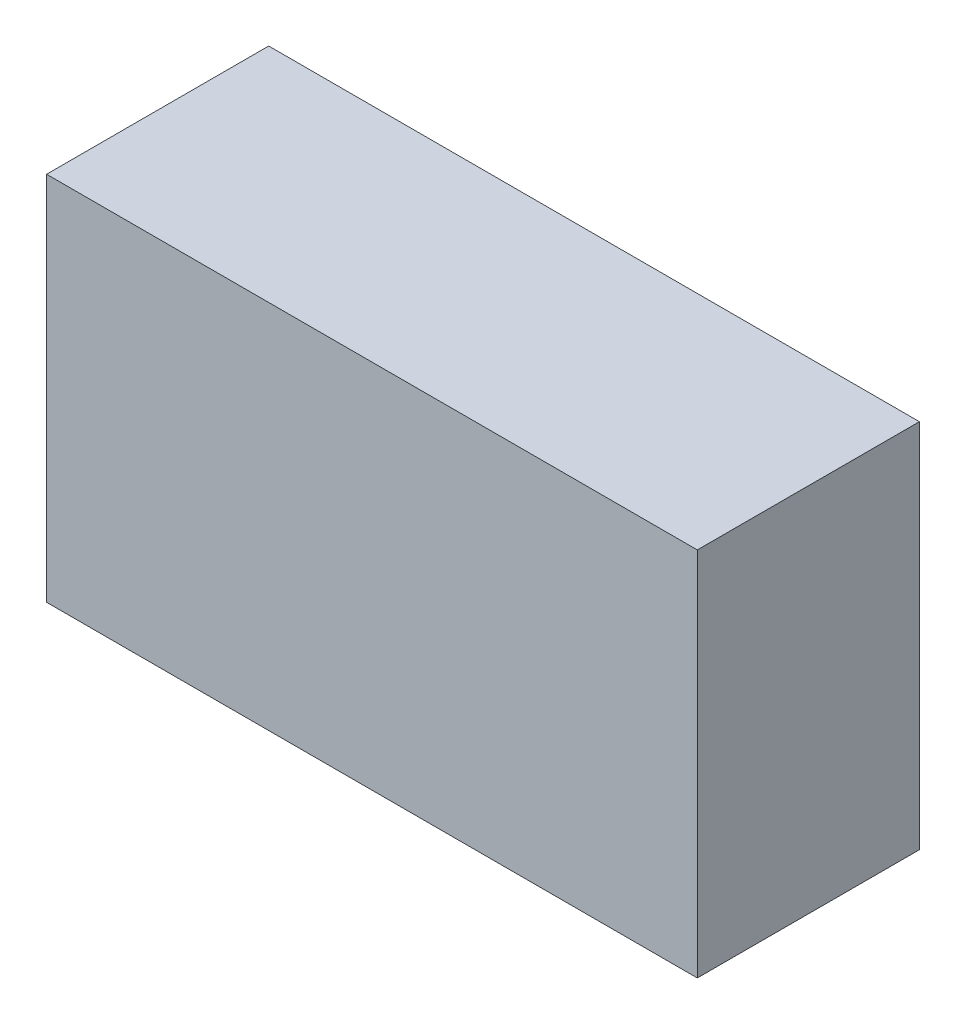
ISO-10303-21;
HEADER;
FILE_DESCRIPTION(('STEP AP214'),'2;1');
FILE_NAME('part.step','',(''),(''),'','','');
FILE_SCHEMA(('AUTOMOTIVE_DESIGN { 1 0 10303 214 1 1 1 1 }'));
ENDSEC;
DATA;
#1=APPLICATION_CONTEXT('core data for automotive mechanical design processes');
#2=APPLICATION_PROTOCOL_DEFINITION('international standard','automotive_design',2000,#1);
#3=PRODUCT_CONTEXT('',#1,'mechanical');
#4=PRODUCT('Part','Part','',(#3));
#5=PRODUCT_RELATED_PRODUCT_CATEGORY('part','',(#4));
#6=PRODUCT_DEFINITION_FORMATION('','',#4);
#7=PRODUCT_DEFINITION_CONTEXT('part definition',#1,'design');
#8=PRODUCT_DEFINITION('design','',#6,#7);
#9=PRODUCT_DEFINITION_SHAPE('','',#8);
#10=(LENGTH_UNIT() NAMED_UNIT(*) SI_UNIT(.MILLI.,.METRE.));
#11=(NAMED_UNIT(*) PLANE_ANGLE_UNIT() SI_UNIT($,.RADIAN.));
#12=(NAMED_UNIT(*) SI_UNIT($,.STERADIAN.) SOLID_ANGLE_UNIT());
#13=UNCERTAINTY_MEASURE_WITH_UNIT(LENGTH_MEASURE(1.E-05),#10,'distance_accuracy_value','');
#14=(GEOMETRIC_REPRESENTATION_CONTEXT(3) GLOBAL_UNCERTAINTY_ASSIGNED_CONTEXT((#13)) GLOBAL_UNIT_ASSIGNED_CONTEXT((#10,
#11,#12)) REPRESENTATION_CONTEXT('',''));
#15=CARTESIAN_POINT('',(0.,0.,0.));
#16=DIRECTION('',(0.,0.,1.));
#17=DIRECTION('',(1.,0.,0.));
#18=AXIS2_PLACEMENT_3D('',#15,#16,#17);
#19=CARTESIAN_POINT('',(-41.4155,77.5714301256037,7.25));
#20=DIRECTION('',(1.,0.,0.));
#21=DIRECTION('',(0.,0.,-1.));
#22=AXIS2_PLACEMENT_3D('',#19,#20,#21);
#23=PLANE('',#22);
#24=DIRECTION('',(0.,-1.,0.));
#25=VECTOR('',#24,1.);
#26=CARTESIAN_POINT('',(-41.4155,77.5714301256037,0.));
#27=LINE('',#26,#25);
#28=CARTESIAN_POINT('',(-41.4155,77.5714301256037,0.));
#29=VERTEX_POINT('',#28);
#30=CARTESIAN_POINT('',(-41.4155,65.47,0.));
#31=VERTEX_POINT('',#30);
#32=EDGE_CURVE('E128',#29,#31,#27,.T.);
#33=ORIENTED_EDGE('',*,*,#32,.T.);
#34=DIRECTION('',(0.,0.,-1.));
#35=VECTOR('',#34,1.);
#36=CARTESIAN_POINT('',(-41.4155,65.47,7.25));
#37=LINE('',#36,#35);
#38=CARTESIAN_POINT('',(-41.4155,65.47,7.25));
#39=VERTEX_POINT('',#38);
#40=EDGE_CURVE('E11',#39,#31,#37,.T.);
#41=ORIENTED_EDGE('',*,*,#40,.F.);
#42=DIRECTION('',(0.,-1.,0.));
#43=VECTOR('',#42,1.);
#44=CARTESIAN_POINT('',(-41.4155,77.5714301256037,7.25));
#45=LINE('',#44,#43);
#46=CARTESIAN_POINT('',(-41.4155,77.5714301256037,7.25));
#47=VERTEX_POINT('',#46);
#48=EDGE_CURVE('E148',#47,#39,#45,.T.);
#49=ORIENTED_EDGE('',*,*,#48,.F.);
#50=DIRECTION('',(0.,0.,-1.));
#51=VECTOR('',#50,1.);
#52=CARTESIAN_POINT('',(-41.4155,77.5714301256037,7.25));
#53=LINE('',#52,#51);
#54=EDGE_CURVE('E153',#47,#29,#53,.T.);
#55=ORIENTED_EDGE('',*,*,#54,.T.);
#56=EDGE_LOOP('',(#33,#41,#49,#55));
#57=FACE_BOUND('',#56,.T.);
#58=ADVANCED_FACE('F32',(#57),#23,.F.);
#59=CARTESIAN_POINT('',(-41.4155,65.47,7.25));
#60=DIRECTION('',(0.,1.,0.));
#61=DIRECTION('',(0.,0.,1.));
#62=AXIS2_PLACEMENT_3D('',#59,#60,#61);
#63=PLANE('',#62);
#64=DIRECTION('',(1.,0.,0.));
#65=VECTOR('',#64,1.);
#66=CARTESIAN_POINT('',(-41.4155,65.47,0.));
#67=LINE('',#66,#65);
#68=CARTESIAN_POINT('',(-20.1755,65.47,0.));
#69=VERTEX_POINT('',#68);
#70=EDGE_CURVE('E132',#31,#69,#67,.T.);
#71=ORIENTED_EDGE('',*,*,#70,.T.);
#72=DIRECTION('',(0.,0.,-1.));
#73=VECTOR('',#72,1.);
#74=CARTESIAN_POINT('',(-20.1755,65.47,7.25));
#75=LINE('',#74,#73);
#76=CARTESIAN_POINT('',(-20.1755,65.47,7.25));
#77=VERTEX_POINT('',#76);
#78=EDGE_CURVE('E39',#77,#69,#75,.T.);
#79=ORIENTED_EDGE('',*,*,#78,.F.);
#80=DIRECTION('',(1.,0.,0.));
#81=VECTOR('',#80,1.);
#82=CARTESIAN_POINT('',(-41.4155,65.47,7.25));
#83=LINE('',#82,#81);
#84=EDGE_CURVE('E83',#39,#77,#83,.T.);
#85=ORIENTED_EDGE('',*,*,#84,.F.);
#86=ORIENTED_EDGE('',*,*,#40,.T.);
#87=EDGE_LOOP('',(#71,#79,#85,#86));
#88=FACE_BOUND('',#87,.T.);
#89=ADVANCED_FACE('F182',(#88),#63,.F.);
#90=CARTESIAN_POINT('',(-20.1755,77.5714301256037,7.25));
#91=DIRECTION('',(-1.,0.,0.));
#92=DIRECTION('',(0.,0.,1.));
#93=AXIS2_PLACEMENT_3D('',#90,#91,#92);
#94=PLANE('',#93);
#95=DIRECTION('',(0.,1.,0.));
#96=VECTOR('',#95,1.);
#97=CARTESIAN_POINT('',(-20.1755,77.5714301256037,0.));
#98=LINE('',#97,#96);
#99=CARTESIAN_POINT('',(-20.1755,77.5714301256037,0.));
#100=VERTEX_POINT('',#99);
#101=EDGE_CURVE('E156',#69,#100,#98,.T.);
#102=ORIENTED_EDGE('',*,*,#101,.T.);
#103=DIRECTION('',(0.,0.,-1.));
#104=VECTOR('',#103,1.);
#105=CARTESIAN_POINT('',(-20.1755,77.5714301256037,7.25));
#106=LINE('',#105,#104);
#107=CARTESIAN_POINT('',(-20.1755,77.5714301256037,7.25));
#108=VERTEX_POINT('',#107);
#109=EDGE_CURVE('E160',#108,#100,#106,.T.);
#110=ORIENTED_EDGE('',*,*,#109,.F.);
#111=DIRECTION('',(0.,1.,0.));
#112=VECTOR('',#111,1.);
#113=CARTESIAN_POINT('',(-20.1755,77.5714301256037,7.25));
#114=LINE('',#113,#112);
#115=EDGE_CURVE('E151',#77,#108,#114,.T.);
#116=ORIENTED_EDGE('',*,*,#115,.F.);
#117=ORIENTED_EDGE('',*,*,#78,.T.);
#118=EDGE_LOOP('',(#102,#110,#116,#117));
#119=FACE_BOUND('',#118,.T.);
#120=ADVANCED_FACE('F165',(#119),#94,.F.);
#121=CARTESIAN_POINT('',(-41.4155,77.5714301256037,7.25));
#122=DIRECTION('',(0.,-1.,0.));
#123=DIRECTION('',(0.,0.,-1.));
#124=AXIS2_PLACEMENT_3D('',#121,#122,#123);
#125=PLANE('',#124);
#126=DIRECTION('',(-1.,0.,0.));
#127=VECTOR('',#126,1.);
#128=CARTESIAN_POINT('',(-41.4155,77.5714301256037,0.));
#129=LINE('',#128,#127);
#130=EDGE_CURVE('E76',#100,#29,#129,.T.);
#131=ORIENTED_EDGE('',*,*,#130,.T.);
#132=ORIENTED_EDGE('',*,*,#54,.F.);
#133=DIRECTION('',(-1.,0.,0.));
#134=VECTOR('',#133,1.);
#135=CARTESIAN_POINT('',(-41.4155,77.5714301256037,7.25));
#136=LINE('',#135,#134);
#137=EDGE_CURVE('E55',#108,#47,#136,.T.);
#138=ORIENTED_EDGE('',*,*,#137,.F.);
#139=ORIENTED_EDGE('',*,*,#109,.T.);
#140=EDGE_LOOP('',(#131,#132,#138,#139));
#141=FACE_BOUND('',#140,.T.);
#142=ADVANCED_FACE('F173',(#141),#125,.F.);
#143=CARTESIAN_POINT('',(0.,0.,7.25));
#144=DIRECTION('',(0.,0.,1.));
#145=DIRECTION('',(1.,0.,0.));
#146=AXIS2_PLACEMENT_3D('',#143,#144,#145);
#147=PLANE('',#146);
#148=ORIENTED_EDGE('',*,*,#48,.T.);
#149=ORIENTED_EDGE('',*,*,#84,.T.);
#150=ORIENTED_EDGE('',*,*,#115,.T.);
#151=ORIENTED_EDGE('',*,*,#137,.T.);
#152=EDGE_LOOP('',(#148,#149,#150,#151));
#153=FACE_BOUND('',#152,.T.);
#154=ADVANCED_FACE('F175',(#153),#147,.T.);
#155=CARTESIAN_POINT('',(0.,0.,0.));
#156=DIRECTION('',(0.,0.,1.));
#157=DIRECTION('',(1.,0.,0.));
#158=AXIS2_PLACEMENT_3D('',#155,#156,#157);
#159=PLANE('',#158);
#160=DIRECTION('',(-1.,0.,0.));
#161=VECTOR('',#160,1.);
#162=CARTESIAN_POINT('',(-41.4155,77.0714301256037,0.));
#163=LINE('',#162,#161);
#164=CARTESIAN_POINT('',(-20.6755,77.0714301256037,0.));
#165=VERTEX_POINT('',#164);
#166=CARTESIAN_POINT('',(-40.9155,77.0714301256037,0.));
#167=VERTEX_POINT('',#166);
#168=EDGE_CURVE('E123',#165,#167,#163,.T.);
#169=ORIENTED_EDGE('',*,*,#168,.T.);
#170=DIRECTION('',(0.,-1.,0.));
#171=VECTOR('',#170,1.);
#172=CARTESIAN_POINT('',(-40.9155,77.5714301256037,0.));
#173=LINE('',#172,#171);
#174=CARTESIAN_POINT('',(-40.9155,65.97,0.));
#175=VERTEX_POINT('',#174);
#176=EDGE_CURVE('E142',#167,#175,#173,.T.);
#177=ORIENTED_EDGE('',*,*,#176,.T.);
#178=DIRECTION('',(1.,0.,0.));
#179=VECTOR('',#178,1.);
#180=CARTESIAN_POINT('',(-41.4155,65.97,0.));
#181=LINE('',#180,#179);
#182=CARTESIAN_POINT('',(-20.6755,65.97,0.));
#183=VERTEX_POINT('',#182);
#184=EDGE_CURVE('E127',#175,#183,#181,.T.);
#185=ORIENTED_EDGE('',*,*,#184,.T.);
#186=DIRECTION('',(0.,1.,0.));
#187=VECTOR('',#186,1.);
#188=CARTESIAN_POINT('',(-20.6755,77.5714301256037,0.));
#189=LINE('',#188,#187);
#190=EDGE_CURVE('E46',#183,#165,#189,.T.);
#191=ORIENTED_EDGE('',*,*,#190,.T.);
#192=EDGE_LOOP('',(#169,#177,#185,#191));
#193=FACE_BOUND('',#192,.T.);
#194=ORIENTED_EDGE('',*,*,#32,.F.);
#195=ORIENTED_EDGE('',*,*,#130,.F.);
#196=ORIENTED_EDGE('',*,*,#101,.F.);
#197=ORIENTED_EDGE('',*,*,#70,.F.);
#198=EDGE_LOOP('',(#194,#195,#196,#197));
#199=FACE_BOUND('',#198,.T.);
#200=ADVANCED_FACE('F169',(#193,#199),#159,.F.);
#201=CARTESIAN_POINT('',(-40.9155,77.5714301256037,7.25));
#202=DIRECTION('',(1.,0.,0.));
#203=DIRECTION('',(0.,0.,-1.));
#204=AXIS2_PLACEMENT_3D('',#201,#202,#203);
#205=PLANE('',#204);
#206=ORIENTED_EDGE('',*,*,#176,.F.);
#207=DIRECTION('',(0.,0.,-1.));
#208=VECTOR('',#207,1.);
#209=CARTESIAN_POINT('',(-40.9155,77.0714301256037,7.25));
#210=LINE('',#209,#208);
#211=CARTESIAN_POINT('',(-40.9155,77.0714301256037,7.05));
#212=VERTEX_POINT('',#211);
#213=EDGE_CURVE('E122',#212,#167,#210,.T.);
#214=ORIENTED_EDGE('',*,*,#213,.F.);
#215=DIRECTION('',(0.,-1.,0.));
#216=VECTOR('',#215,1.);
#217=CARTESIAN_POINT('',(-40.9155,77.5714301256037,7.05));
#218=LINE('',#217,#216);
#219=CARTESIAN_POINT('',(-40.9155,65.97,7.05));
#220=VERTEX_POINT('',#219);
#221=EDGE_CURVE('E110',#212,#220,#218,.T.);
#222=ORIENTED_EDGE('',*,*,#221,.T.);
#223=DIRECTION('',(0.,0.,-1.));
#224=VECTOR('',#223,1.);
#225=CARTESIAN_POINT('',(-40.9155,65.97,7.25));
#226=LINE('',#225,#224);
#227=EDGE_CURVE('E120',#220,#175,#226,.T.);
#228=ORIENTED_EDGE('',*,*,#227,.T.);
#229=EDGE_LOOP('',(#206,#214,#222,#228));
#230=FACE_BOUND('',#229,.T.);
#231=ADVANCED_FACE('F119',(#230),#205,.T.);
#232=CARTESIAN_POINT('',(-41.4155,65.97,7.25));
#233=DIRECTION('',(0.,1.,0.));
#234=DIRECTION('',(0.,0.,1.));
#235=AXIS2_PLACEMENT_3D('',#232,#233,#234);
#236=PLANE('',#235);
#237=ORIENTED_EDGE('',*,*,#184,.F.);
#238=ORIENTED_EDGE('',*,*,#227,.F.);
#239=DIRECTION('',(1.,0.,0.));
#240=VECTOR('',#239,1.);
#241=CARTESIAN_POINT('',(-41.4155,65.97,7.05));
#242=LINE('',#241,#240);
#243=CARTESIAN_POINT('',(-20.6755,65.97,7.05));
#244=VERTEX_POINT('',#243);
#245=EDGE_CURVE('E106',#220,#244,#242,.T.);
#246=ORIENTED_EDGE('',*,*,#245,.T.);
#247=DIRECTION('',(0.,0.,-1.));
#248=VECTOR('',#247,1.);
#249=CARTESIAN_POINT('',(-20.6755,65.97,7.25));
#250=LINE('',#249,#248);
#251=EDGE_CURVE('E129',#244,#183,#250,.T.);
#252=ORIENTED_EDGE('',*,*,#251,.T.);
#253=EDGE_LOOP('',(#237,#238,#246,#252));
#254=FACE_BOUND('',#253,.T.);
#255=ADVANCED_FACE('F125',(#254),#236,.T.);
#256=CARTESIAN_POINT('',(-20.6755,77.5714301256037,7.25));
#257=DIRECTION('',(-1.,0.,0.));
#258=DIRECTION('',(0.,0.,1.));
#259=AXIS2_PLACEMENT_3D('',#256,#257,#258);
#260=PLANE('',#259);
#261=ORIENTED_EDGE('',*,*,#190,.F.);
#262=ORIENTED_EDGE('',*,*,#251,.F.);
#263=DIRECTION('',(0.,1.,0.));
#264=VECTOR('',#263,1.);
#265=CARTESIAN_POINT('',(-20.6755,77.5714301256037,7.05));
#266=LINE('',#265,#264);
#267=CARTESIAN_POINT('',(-20.6755,77.0714301256037,7.05));
#268=VERTEX_POINT('',#267);
#269=EDGE_CURVE('E111',#244,#268,#266,.T.);
#270=ORIENTED_EDGE('',*,*,#269,.T.);
#271=DIRECTION('',(0.,0.,-1.));
#272=VECTOR('',#271,1.);
#273=CARTESIAN_POINT('',(-20.6755,77.0714301256037,7.25));
#274=LINE('',#273,#272);
#275=EDGE_CURVE('E134',#268,#165,#274,.T.);
#276=ORIENTED_EDGE('',*,*,#275,.T.);
#277=EDGE_LOOP('',(#261,#262,#270,#276));
#278=FACE_BOUND('',#277,.T.);
#279=ADVANCED_FACE('F230',(#278),#260,.T.);
#280=CARTESIAN_POINT('',(-41.4155,77.0714301256037,7.25));
#281=DIRECTION('',(0.,-1.,0.));
#282=DIRECTION('',(0.,0.,-1.));
#283=AXIS2_PLACEMENT_3D('',#280,#281,#282);
#284=PLANE('',#283);
#285=ORIENTED_EDGE('',*,*,#168,.F.);
#286=ORIENTED_EDGE('',*,*,#275,.F.);
#287=DIRECTION('',(-1.,0.,0.));
#288=VECTOR('',#287,1.);
#289=CARTESIAN_POINT('',(-41.4155,77.0714301256037,7.05));
#290=LINE('',#289,#288);
#291=EDGE_CURVE('E137',#268,#212,#290,.T.);
#292=ORIENTED_EDGE('',*,*,#291,.T.);
#293=ORIENTED_EDGE('',*,*,#213,.T.);
#294=EDGE_LOOP('',(#285,#286,#292,#293));
#295=FACE_BOUND('',#294,.T.);
#296=ADVANCED_FACE('F239',(#295),#284,.T.);
#297=CARTESIAN_POINT('',(0.,0.,7.05));
#298=DIRECTION('',(0.,0.,1.));
#299=DIRECTION('',(1.,0.,0.));
#300=AXIS2_PLACEMENT_3D('',#297,#298,#299);
#301=PLANE('',#300);
#302=ORIENTED_EDGE('',*,*,#221,.F.);
#303=ORIENTED_EDGE('',*,*,#291,.F.);
#304=ORIENTED_EDGE('',*,*,#269,.F.);
#305=ORIENTED_EDGE('',*,*,#245,.F.);
#306=EDGE_LOOP('',(#302,#303,#304,#305));
#307=FACE_BOUND('',#306,.T.);
#308=ADVANCED_FACE('F108',(#307),#301,.F.);
#309=CLOSED_SHELL('',(#58,#89,#120,#142,#154,#200,#231,#255,#279,#296,#308));
#310=MANIFOLD_SOLID_BREP('B2',#309);
#311=ADVANCED_BREP_SHAPE_REPRESENTATION('',(#18,#310),#14);
#312=SHAPE_DEFINITION_REPRESENTATION(#9,#311);
ENDSEC;
END-ISO-10303-21;
